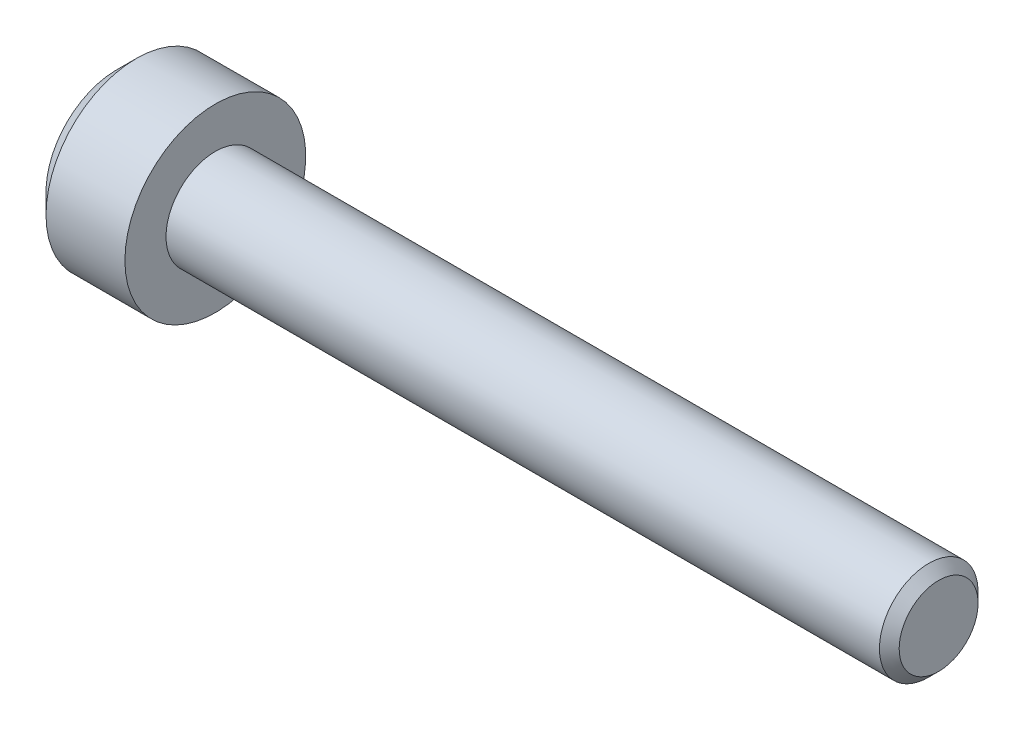
ISO-10303-21;
HEADER;
FILE_DESCRIPTION(('STEP AP214'),'2;1');
FILE_NAME('part.step','',(''),(''),'','','');
FILE_SCHEMA(('AUTOMOTIVE_DESIGN { 1 0 10303 214 1 1 1 1 }'));
ENDSEC;
DATA;
#1=APPLICATION_CONTEXT('core data for automotive mechanical design processes');
#2=APPLICATION_PROTOCOL_DEFINITION('international standard','automotive_design',2000,#1);
#3=PRODUCT_CONTEXT('',#1,'mechanical');
#4=PRODUCT('Part','Part','',(#3));
#5=PRODUCT_RELATED_PRODUCT_CATEGORY('part','',(#4));
#6=PRODUCT_DEFINITION_FORMATION('','',#4);
#7=PRODUCT_DEFINITION_CONTEXT('part definition',#1,'design');
#8=PRODUCT_DEFINITION('design','',#6,#7);
#9=PRODUCT_DEFINITION_SHAPE('','',#8);
#10=(LENGTH_UNIT() NAMED_UNIT(*) SI_UNIT(.MILLI.,.METRE.));
#11=(NAMED_UNIT(*) PLANE_ANGLE_UNIT() SI_UNIT($,.RADIAN.));
#12=(NAMED_UNIT(*) SI_UNIT($,.STERADIAN.) SOLID_ANGLE_UNIT());
#13=UNCERTAINTY_MEASURE_WITH_UNIT(LENGTH_MEASURE(1.E-05),#10,'distance_accuracy_value','');
#14=(GEOMETRIC_REPRESENTATION_CONTEXT(3) GLOBAL_UNCERTAINTY_ASSIGNED_CONTEXT((#13)) GLOBAL_UNIT_ASSIGNED_CONTEXT((#10,
#11,#12)) REPRESENTATION_CONTEXT('',''));
#15=CARTESIAN_POINT('',(0.,0.,0.));
#16=DIRECTION('',(0.,0.,1.));
#17=DIRECTION('',(1.,0.,0.));
#18=AXIS2_PLACEMENT_3D('',#15,#16,#17);
#19=CARTESIAN_POINT('',(0.,0.,0.));
#20=DIRECTION('',(-1.,0.,0.));
#21=DIRECTION('',(0.,0.,1.));
#22=AXIS2_PLACEMENT_3D('',#19,#20,#21);
#23=PLANE('',#22);
#24=CARTESIAN_POINT('',(0.,0.,0.));
#25=DIRECTION('',(-1.,0.,0.));
#26=DIRECTION('',(0.,0.,1.));
#27=AXIS2_PLACEMENT_3D('',#24,#25,#26);
#28=CIRCLE('',#27,1.2);
#29=CARTESIAN_POINT('',(0.,0.,1.2));
#30=VERTEX_POINT('',#29);
#31=EDGE_CURVE('E158',#30,#30,#28,.F.);
#32=ORIENTED_EDGE('',*,*,#31,.T.);
#33=EDGE_LOOP('',(#32));
#34=FACE_BOUND('',#33,.T.);
#35=ADVANCED_FACE('F51',(#34),#23,.F.);
#36=CARTESIAN_POINT('',(0.,0.,0.));
#37=DIRECTION('',(-1.,0.,0.));
#38=DIRECTION('',(0.,0.,1.));
#39=AXIS2_PLACEMENT_3D('',#36,#37,#38);
#40=CYLINDRICAL_SURFACE('',#39,1.5);
#41=CARTESIAN_POINT('',(-0.300000000000004,0.,0.));
#42=DIRECTION('',(-1.,0.,0.));
#43=DIRECTION('',(0.,0.,1.));
#44=AXIS2_PLACEMENT_3D('',#41,#42,#43);
#45=CIRCLE('',#44,1.5);
#46=CARTESIAN_POINT('',(-0.300000000000004,0.,1.5));
#47=VERTEX_POINT('',#46);
#48=EDGE_CURVE('E154',#47,#47,#45,.T.);
#49=ORIENTED_EDGE('',*,*,#48,.T.);
#50=EDGE_LOOP('',(#49));
#51=FACE_BOUND('',#50,.T.);
#52=CARTESIAN_POINT('',(-22.,0.,0.));
#53=DIRECTION('',(-1.,0.,0.));
#54=DIRECTION('',(0.,0.,1.));
#55=AXIS2_PLACEMENT_3D('',#52,#53,#54);
#56=CIRCLE('',#55,1.5);
#57=CARTESIAN_POINT('',(-22.,0.,1.5));
#58=VERTEX_POINT('',#57);
#59=EDGE_CURVE('E150',#58,#58,#56,.T.);
#60=ORIENTED_EDGE('',*,*,#59,.F.);
#61=EDGE_LOOP('',(#60));
#62=FACE_BOUND('',#61,.T.);
#63=ADVANCED_FACE('F184',(#51,#62),#40,.T.);
#64=CARTESIAN_POINT('',(-22.,1.5,0.));
#65=DIRECTION('',(-1.,0.,0.));
#66=DIRECTION('',(0.,0.,1.));
#67=AXIS2_PLACEMENT_3D('',#64,#65,#66);
#68=PLANE('',#67);
#69=CARTESIAN_POINT('',(-22.,0.,0.));
#70=DIRECTION('',(-1.,0.,0.));
#71=DIRECTION('',(0.,0.,1.));
#72=AXIS2_PLACEMENT_3D('',#69,#70,#71);
#73=CIRCLE('',#72,2.75);
#74=CARTESIAN_POINT('',(-22.,0.,2.75));
#75=VERTEX_POINT('',#74);
#76=EDGE_CURVE('E134',#75,#75,#73,.T.);
#77=ORIENTED_EDGE('',*,*,#76,.F.);
#78=EDGE_LOOP('',(#77));
#79=FACE_BOUND('',#78,.T.);
#80=ORIENTED_EDGE('',*,*,#59,.T.);
#81=EDGE_LOOP('',(#80));
#82=FACE_BOUND('',#81,.T.);
#83=ADVANCED_FACE('F190',(#79,#82),#68,.F.);
#84=CARTESIAN_POINT('',(0.,0.,0.));
#85=DIRECTION('',(-1.,0.,0.));
#86=DIRECTION('',(0.,0.,1.));
#87=AXIS2_PLACEMENT_3D('',#84,#85,#86);
#88=CYLINDRICAL_SURFACE('',#87,2.75);
#89=CARTESIAN_POINT('',(-24.4,0.,0.));
#90=DIRECTION('',(1.,0.,0.));
#91=DIRECTION('',(0.,0.,-1.));
#92=AXIS2_PLACEMENT_3D('',#89,#90,#91);
#93=CIRCLE('',#92,2.75);
#94=CARTESIAN_POINT('',(-24.4,0.,-2.75));
#95=VERTEX_POINT('',#94);
#96=EDGE_CURVE('E11',#95,#95,#93,.T.);
#97=ORIENTED_EDGE('',*,*,#96,.T.);
#98=EDGE_LOOP('',(#97));
#99=FACE_BOUND('',#98,.T.);
#100=ORIENTED_EDGE('',*,*,#76,.T.);
#101=EDGE_LOOP('',(#100));
#102=FACE_BOUND('',#101,.T.);
#103=ADVANCED_FACE('F203',(#99,#102),#88,.T.);
#104=CARTESIAN_POINT('',(-25.,2.75,0.));
#105=DIRECTION('',(1.,0.,0.));
#106=DIRECTION('',(0.,0.,-1.));
#107=AXIS2_PLACEMENT_3D('',#104,#105,#106);
#108=PLANE('',#107);
#109=CARTESIAN_POINT('',(-25.,0.,0.));
#110=DIRECTION('',(1.,0.,0.));
#111=DIRECTION('',(0.,0.,-1.));
#112=AXIS2_PLACEMENT_3D('',#109,#110,#111);
#113=CIRCLE('',#112,2.15000000000001);
#114=CARTESIAN_POINT('',(-25.,0.,-2.15000000000001));
#115=VERTEX_POINT('',#114);
#116=EDGE_CURVE('E60',#115,#115,#113,.F.);
#117=ORIENTED_EDGE('',*,*,#116,.T.);
#118=EDGE_LOOP('',(#117));
#119=FACE_BOUND('',#118,.T.);
#120=DIRECTION('',(0.,-0.5,-0.866025403784439));
#121=VECTOR('',#120,1.);
#122=CARTESIAN_POINT('',(-25.,1.44337567297406,0.));
#123=LINE('',#122,#121);
#124=CARTESIAN_POINT('',(-25.,1.44337567297406,0.));
#125=VERTEX_POINT('',#124);
#126=CARTESIAN_POINT('',(-25.,0.721687836487033,-1.25));
#127=VERTEX_POINT('',#126);
#128=EDGE_CURVE('E428',#125,#127,#123,.T.);
#129=ORIENTED_EDGE('',*,*,#128,.F.);
#130=DIRECTION('',(0.,0.5,-0.866025403784439));
#131=VECTOR('',#130,1.);
#132=CARTESIAN_POINT('',(-25.,0.721687836487032,1.25));
#133=LINE('',#132,#131);
#134=CARTESIAN_POINT('',(-25.,0.721687836487032,1.25));
#135=VERTEX_POINT('',#134);
#136=EDGE_CURVE('E67',#135,#125,#133,.T.);
#137=ORIENTED_EDGE('',*,*,#136,.F.);
#138=DIRECTION('',(0.,1.,0.));
#139=VECTOR('',#138,1.);
#140=CARTESIAN_POINT('',(-25.,-0.721687836487033,1.25));
#141=LINE('',#140,#139);
#142=CARTESIAN_POINT('',(-25.,-0.721687836487033,1.25));
#143=VERTEX_POINT('',#142);
#144=EDGE_CURVE('E102',#143,#135,#141,.T.);
#145=ORIENTED_EDGE('',*,*,#144,.F.);
#146=DIRECTION('',(0.,0.5,0.866025403784439));
#147=VECTOR('',#146,1.);
#148=CARTESIAN_POINT('',(-25.,-1.44337567297406,0.));
#149=LINE('',#148,#147);
#150=CARTESIAN_POINT('',(-25.,-1.44337567297406,0.));
#151=VERTEX_POINT('',#150);
#152=EDGE_CURVE('E111',#151,#143,#149,.T.);
#153=ORIENTED_EDGE('',*,*,#152,.F.);
#154=DIRECTION('',(0.,-0.5,0.866025403784439));
#155=VECTOR('',#154,1.);
#156=CARTESIAN_POINT('',(-25.,-0.721687836487032,-1.25));
#157=LINE('',#156,#155);
#158=CARTESIAN_POINT('',(-25.,-0.721687836487032,-1.25));
#159=VERTEX_POINT('',#158);
#160=EDGE_CURVE('E118',#159,#151,#157,.T.);
#161=ORIENTED_EDGE('',*,*,#160,.F.);
#162=DIRECTION('',(0.,-1.,0.));
#163=VECTOR('',#162,1.);
#164=CARTESIAN_POINT('',(-25.,0.721687836487033,-1.25));
#165=LINE('',#164,#163);
#166=EDGE_CURVE('E432',#127,#159,#165,.T.);
#167=ORIENTED_EDGE('',*,*,#166,.F.);
#168=EDGE_LOOP('',(#129,#137,#145,#153,#161,#167));
#169=FACE_BOUND('',#168,.T.);
#170=ADVANCED_FACE('F121',(#119,#169),#108,.F.);
#171=CARTESIAN_POINT('',(-0.300000000000004,0.,0.));
#172=DIRECTION('',(-1.,0.,0.));
#173=DIRECTION('',(0.,0.,1.));
#174=AXIS2_PLACEMENT_3D('',#171,#172,#173);
#175=CONICAL_SURFACE('',#174,1.5,0.785398163397445);
#176=ORIENTED_EDGE('',*,*,#31,.F.);
#177=EDGE_LOOP('',(#176));
#178=FACE_BOUND('',#177,.T.);
#179=ORIENTED_EDGE('',*,*,#48,.F.);
#180=EDGE_LOOP('',(#179));
#181=FACE_BOUND('',#180,.T.);
#182=ADVANCED_FACE('F194',(#178,#181),#175,.T.);
#183=CARTESIAN_POINT('',(-23.5,0.721687836487032,1.25));
#184=DIRECTION('',(0.,0.866025403784439,0.5));
#185=DIRECTION('',(0.,-0.5,0.866025403784439));
#186=AXIS2_PLACEMENT_3D('',#183,#184,#185);
#187=PLANE('',#186);
#188=ORIENTED_EDGE('',*,*,#136,.T.);
#189=DIRECTION('',(-1.,0.,0.));
#190=VECTOR('',#189,1.);
#191=CARTESIAN_POINT('',(-23.5,1.44337567297406,0.));
#192=LINE('',#191,#190);
#193=CARTESIAN_POINT('',(-23.5,1.44337567297407,0.));
#194=VERTEX_POINT('',#193);
#195=EDGE_CURVE('E144',#194,#125,#192,.T.);
#196=ORIENTED_EDGE('',*,*,#195,.F.);
#197=DIRECTION('',(0.,0.5,-0.866025403784439));
#198=VECTOR('',#197,1.);
#199=CARTESIAN_POINT('',(-23.5,0.721687836487032,1.25));
#200=LINE('',#199,#198);
#201=CARTESIAN_POINT('',(-23.5,0.721687836487032,1.25));
#202=VERTEX_POINT('',#201);
#203=EDGE_CURVE('E123',#202,#194,#200,.T.);
#204=ORIENTED_EDGE('',*,*,#203,.F.);
#205=DIRECTION('',(-1.,0.,0.));
#206=VECTOR('',#205,1.);
#207=CARTESIAN_POINT('',(-23.5,0.721687836487032,1.25));
#208=LINE('',#207,#206);
#209=EDGE_CURVE('E107',#202,#135,#208,.T.);
#210=ORIENTED_EDGE('',*,*,#209,.T.);
#211=EDGE_LOOP('',(#188,#196,#204,#210));
#212=FACE_BOUND('',#211,.T.);
#213=ADVANCED_FACE('F196',(#212),#187,.F.);
#214=CARTESIAN_POINT('',(-23.5,-0.721687836487033,1.25));
#215=DIRECTION('',(0.,0.,1.));
#216=DIRECTION('',(1.,0.,0.));
#217=AXIS2_PLACEMENT_3D('',#214,#215,#216);
#218=PLANE('',#217);
#219=ORIENTED_EDGE('',*,*,#144,.T.);
#220=ORIENTED_EDGE('',*,*,#209,.F.);
#221=DIRECTION('',(0.,1.,0.));
#222=VECTOR('',#221,1.);
#223=CARTESIAN_POINT('',(-23.5,-0.721687836487033,1.25));
#224=LINE('',#223,#222);
#225=CARTESIAN_POINT('',(-23.5,-0.721687836487033,1.25));
#226=VERTEX_POINT('',#225);
#227=EDGE_CURVE('E104',#226,#202,#224,.T.);
#228=ORIENTED_EDGE('',*,*,#227,.F.);
#229=DIRECTION('',(-1.,0.,0.));
#230=VECTOR('',#229,1.);
#231=CARTESIAN_POINT('',(-23.5,-0.721687836487033,1.25));
#232=LINE('',#231,#230);
#233=EDGE_CURVE('E97',#226,#143,#232,.T.);
#234=ORIENTED_EDGE('',*,*,#233,.T.);
#235=EDGE_LOOP('',(#219,#220,#228,#234));
#236=FACE_BOUND('',#235,.T.);
#237=ADVANCED_FACE('F99',(#236),#218,.F.);
#238=CARTESIAN_POINT('',(-23.5,-1.44337567297406,0.));
#239=DIRECTION('',(0.,-0.866025403784439,0.5));
#240=DIRECTION('',(0.,-0.5,-0.866025403784439));
#241=AXIS2_PLACEMENT_3D('',#238,#239,#240);
#242=PLANE('',#241);
#243=ORIENTED_EDGE('',*,*,#152,.T.);
#244=ORIENTED_EDGE('',*,*,#233,.F.);
#245=DIRECTION('',(0.,0.5,0.866025403784439));
#246=VECTOR('',#245,1.);
#247=CARTESIAN_POINT('',(-23.5,-1.44337567297406,0.));
#248=LINE('',#247,#246);
#249=CARTESIAN_POINT('',(-23.5,-1.44337567297407,0.));
#250=VERTEX_POINT('',#249);
#251=EDGE_CURVE('E76',#250,#226,#248,.T.);
#252=ORIENTED_EDGE('',*,*,#251,.F.);
#253=DIRECTION('',(-1.,0.,0.));
#254=VECTOR('',#253,1.);
#255=CARTESIAN_POINT('',(-23.5,-1.44337567297406,0.));
#256=LINE('',#255,#254);
#257=EDGE_CURVE('E108',#250,#151,#256,.T.);
#258=ORIENTED_EDGE('',*,*,#257,.T.);
#259=EDGE_LOOP('',(#243,#244,#252,#258));
#260=FACE_BOUND('',#259,.T.);
#261=ADVANCED_FACE('F112',(#260),#242,.F.);
#262=CARTESIAN_POINT('',(-23.5,-0.721687836487032,-1.25));
#263=DIRECTION('',(0.,-0.866025403784438,-0.5));
#264=DIRECTION('',(0.,0.5,-0.866025403784439));
#265=AXIS2_PLACEMENT_3D('',#262,#263,#264);
#266=PLANE('',#265);
#267=ORIENTED_EDGE('',*,*,#160,.T.);
#268=ORIENTED_EDGE('',*,*,#257,.F.);
#269=DIRECTION('',(0.,-0.5,0.866025403784439));
#270=VECTOR('',#269,1.);
#271=CARTESIAN_POINT('',(-23.5,-0.721687836487032,-1.25));
#272=LINE('',#271,#270);
#273=CARTESIAN_POINT('',(-23.5,-0.721687836487032,-1.25));
#274=VERTEX_POINT('',#273);
#275=EDGE_CURVE('E421',#274,#250,#272,.T.);
#276=ORIENTED_EDGE('',*,*,#275,.F.);
#277=DIRECTION('',(-1.,0.,0.));
#278=VECTOR('',#277,1.);
#279=CARTESIAN_POINT('',(-23.5,-0.721687836487032,-1.25));
#280=LINE('',#279,#278);
#281=EDGE_CURVE('E138',#274,#159,#280,.T.);
#282=ORIENTED_EDGE('',*,*,#281,.T.);
#283=EDGE_LOOP('',(#267,#268,#276,#282));
#284=FACE_BOUND('',#283,.T.);
#285=ADVANCED_FACE('F222',(#284),#266,.F.);
#286=CARTESIAN_POINT('',(-23.5,0.721687836487033,-1.25));
#287=DIRECTION('',(0.,0.,-1.));
#288=DIRECTION('',(0.,1.,0.));
#289=AXIS2_PLACEMENT_3D('',#286,#287,#288);
#290=PLANE('',#289);
#291=ORIENTED_EDGE('',*,*,#166,.T.);
#292=ORIENTED_EDGE('',*,*,#281,.F.);
#293=DIRECTION('',(0.,-1.,0.));
#294=VECTOR('',#293,1.);
#295=CARTESIAN_POINT('',(-23.5,0.721687836487033,-1.25));
#296=LINE('',#295,#294);
#297=CARTESIAN_POINT('',(-23.5,0.721687836487033,-1.25));
#298=VERTEX_POINT('',#297);
#299=EDGE_CURVE('E418',#298,#274,#296,.T.);
#300=ORIENTED_EDGE('',*,*,#299,.F.);
#301=DIRECTION('',(-1.,0.,0.));
#302=VECTOR('',#301,1.);
#303=CARTESIAN_POINT('',(-23.5,0.721687836487033,-1.25));
#304=LINE('',#303,#302);
#305=EDGE_CURVE('E141',#298,#127,#304,.T.);
#306=ORIENTED_EDGE('',*,*,#305,.T.);
#307=EDGE_LOOP('',(#291,#292,#300,#306));
#308=FACE_BOUND('',#307,.T.);
#309=ADVANCED_FACE('F179',(#308),#290,.F.);
#310=CARTESIAN_POINT('',(-23.5,1.44337567297406,0.));
#311=DIRECTION('',(0.,0.866025403784439,-0.5));
#312=DIRECTION('',(0.,0.5,0.866025403784439));
#313=AXIS2_PLACEMENT_3D('',#310,#311,#312);
#314=PLANE('',#313);
#315=ORIENTED_EDGE('',*,*,#128,.T.);
#316=ORIENTED_EDGE('',*,*,#305,.F.);
#317=DIRECTION('',(0.,-0.5,-0.866025403784439));
#318=VECTOR('',#317,1.);
#319=CARTESIAN_POINT('',(-23.5,1.44337567297406,0.));
#320=LINE('',#319,#318);
#321=EDGE_CURVE('E129',#194,#298,#320,.T.);
#322=ORIENTED_EDGE('',*,*,#321,.F.);
#323=ORIENTED_EDGE('',*,*,#195,.T.);
#324=EDGE_LOOP('',(#315,#316,#322,#323));
#325=FACE_BOUND('',#324,.T.);
#326=ADVANCED_FACE('F170',(#325),#314,.F.);
#327=CARTESIAN_POINT('',(-25.,0.,0.));
#328=DIRECTION('',(1.,0.,0.));
#329=DIRECTION('',(0.,0.,-1.));
#330=AXIS2_PLACEMENT_3D('',#327,#328,#329);
#331=CONICAL_SURFACE('',#330,2.15000000000001,0.785398163397446);
#332=ORIENTED_EDGE('',*,*,#96,.F.);
#333=EDGE_LOOP('',(#332));
#334=FACE_BOUND('',#333,.T.);
#335=ORIENTED_EDGE('',*,*,#116,.F.);
#336=EDGE_LOOP('',(#335));
#337=FACE_BOUND('',#336,.T.);
#338=ADVANCED_FACE('F53',(#334,#337),#331,.T.);
#339=CARTESIAN_POINT('',(-23.5,-0.721687836487032,-1.25));
#340=DIRECTION('',(0.857167300702113,-0.446036056788338,-0.257519037455026));
#341=DIRECTION('',(0.461604487477352,0.887085845417889,0.));
#342=AXIS2_PLACEMENT_3D('',#339,#340,#341);
#343=PLANE('',#342);
#344=ORIENTED_EDGE('',*,*,#275,.T.);
#345=DIRECTION('',(-0.461604487477352,-0.887085845417889,0.));
#346=VECTOR('',#345,1.);
#347=CARTESIAN_POINT('',(-23.2044812389213,-0.875464144554972,0.));
#348=LINE('',#347,#346);
#349=CARTESIAN_POINT('',(-22.7489242262155,0.,0.));
#350=VERTEX_POINT('',#349);
#351=EDGE_CURVE('E442',#350,#250,#348,.T.);
#352=ORIENTED_EDGE('',*,*,#351,.F.);
#353=DIRECTION('',(-0.461604487477352,-0.443542922708944,-0.768238877469488));
#354=VECTOR('',#353,1.);
#355=CARTESIAN_POINT('',(-23.2044812389213,-0.437732072277486,-0.758174189287018));
#356=LINE('',#355,#354);
#357=EDGE_CURVE('E402',#350,#274,#356,.T.);
#358=ORIENTED_EDGE('',*,*,#357,.T.);
#359=EDGE_LOOP('',(#344,#352,#358));
#360=FACE_BOUND('',#359,.T.);
#361=ADVANCED_FACE('F169',(#360),#343,.F.);
#362=CARTESIAN_POINT('',(-23.5,0.721687836487033,-1.25));
#363=DIRECTION('',(0.857167300702113,0.,-0.515038074910052));
#364=DIRECTION('',(-0.515038074910052,0.,-0.857167300702113));
#365=AXIS2_PLACEMENT_3D('',#362,#363,#364);
#366=PLANE('',#365);
#367=ORIENTED_EDGE('',*,*,#299,.T.);
#368=ORIENTED_EDGE('',*,*,#357,.F.);
#369=DIRECTION('',(-0.461604487477352,0.443542922708945,-0.768238877469488));
#370=VECTOR('',#369,1.);
#371=CARTESIAN_POINT('',(-23.2044812389213,0.437732072277487,-0.758174189287018));
#372=LINE('',#371,#370);
#373=EDGE_CURVE('E404',#350,#298,#372,.T.);
#374=ORIENTED_EDGE('',*,*,#373,.T.);
#375=EDGE_LOOP('',(#367,#368,#374));
#376=FACE_BOUND('',#375,.T.);
#377=ADVANCED_FACE('F176',(#376),#366,.F.);
#378=CARTESIAN_POINT('',(-23.5,1.44337567297407,0.));
#379=DIRECTION('',(0.857167300702113,0.446036056788338,-0.257519037455026));
#380=DIRECTION('',(-0.461604487477352,0.887085845417889,0.));
#381=AXIS2_PLACEMENT_3D('',#378,#379,#380);
#382=PLANE('',#381);
#383=ORIENTED_EDGE('',*,*,#321,.T.);
#384=ORIENTED_EDGE('',*,*,#373,.F.);
#385=DIRECTION('',(-0.461604487477352,0.887085845417889,0.));
#386=VECTOR('',#385,1.);
#387=CARTESIAN_POINT('',(-23.2044812389213,0.875464144554973,0.));
#388=LINE('',#387,#386);
#389=EDGE_CURVE('E389',#350,#194,#388,.T.);
#390=ORIENTED_EDGE('',*,*,#389,.T.);
#391=EDGE_LOOP('',(#383,#384,#390));
#392=FACE_BOUND('',#391,.T.);
#393=ADVANCED_FACE('F233',(#392),#382,.F.);
#394=CARTESIAN_POINT('',(-23.5,0.721687836487032,1.25));
#395=DIRECTION('',(0.857167300702113,0.446036056788338,0.257519037455026));
#396=DIRECTION('',(-0.461604487477352,0.887085845417889,0.));
#397=AXIS2_PLACEMENT_3D('',#394,#395,#396);
#398=PLANE('',#397);
#399=ORIENTED_EDGE('',*,*,#203,.T.);
#400=ORIENTED_EDGE('',*,*,#389,.F.);
#401=DIRECTION('',(-0.461604487477352,0.443542922708944,0.768238877469488));
#402=VECTOR('',#401,1.);
#403=CARTESIAN_POINT('',(-23.2044812389213,0.437732072277486,0.758174189287019));
#404=LINE('',#403,#402);
#405=EDGE_CURVE('E378',#350,#202,#404,.T.);
#406=ORIENTED_EDGE('',*,*,#405,.T.);
#407=EDGE_LOOP('',(#399,#400,#406));
#408=FACE_BOUND('',#407,.T.);
#409=ADVANCED_FACE('F237',(#408),#398,.F.);
#410=CARTESIAN_POINT('',(-23.5,-0.721687836487033,1.25));
#411=DIRECTION('',(0.857167300702113,0.,0.515038074910052));
#412=DIRECTION('',(0.515038074910052,0.,-0.857167300702113));
#413=AXIS2_PLACEMENT_3D('',#410,#411,#412);
#414=PLANE('',#413);
#415=ORIENTED_EDGE('',*,*,#227,.T.);
#416=ORIENTED_EDGE('',*,*,#405,.F.);
#417=DIRECTION('',(-0.461604487477352,-0.443542922708945,0.768238877469487));
#418=VECTOR('',#417,1.);
#419=CARTESIAN_POINT('',(-23.2044812389213,-0.437732072277487,0.758174189287018));
#420=LINE('',#419,#418);
#421=EDGE_CURVE('E379',#350,#226,#420,.T.);
#422=ORIENTED_EDGE('',*,*,#421,.T.);
#423=EDGE_LOOP('',(#415,#416,#422));
#424=FACE_BOUND('',#423,.T.);
#425=ADVANCED_FACE('F241',(#424),#414,.F.);
#426=CARTESIAN_POINT('',(-23.5,-1.44337567297407,0.));
#427=DIRECTION('',(0.857167300702113,-0.446036056788338,0.257519037455026));
#428=DIRECTION('',(0.461604487477352,0.887085845417889,0.));
#429=AXIS2_PLACEMENT_3D('',#426,#427,#428);
#430=PLANE('',#429);
#431=ORIENTED_EDGE('',*,*,#251,.T.);
#432=ORIENTED_EDGE('',*,*,#421,.F.);
#433=ORIENTED_EDGE('',*,*,#351,.T.);
#434=EDGE_LOOP('',(#431,#432,#433));
#435=FACE_BOUND('',#434,.T.);
#436=ADVANCED_FACE('F245',(#435),#430,.F.);
#437=CLOSED_SHELL('',(#35,#63,#83,#103,#170,#182,#213,#237,#261,#285,#309,#326,#338,#361,#377,
#393,#409,#425,#436));
#438=MANIFOLD_SOLID_BREP('B2',#437);
#439=ADVANCED_BREP_SHAPE_REPRESENTATION('',(#18,#438),#14);
#440=SHAPE_DEFINITION_REPRESENTATION(#9,#439);
ENDSEC;
END-ISO-10303-21;
